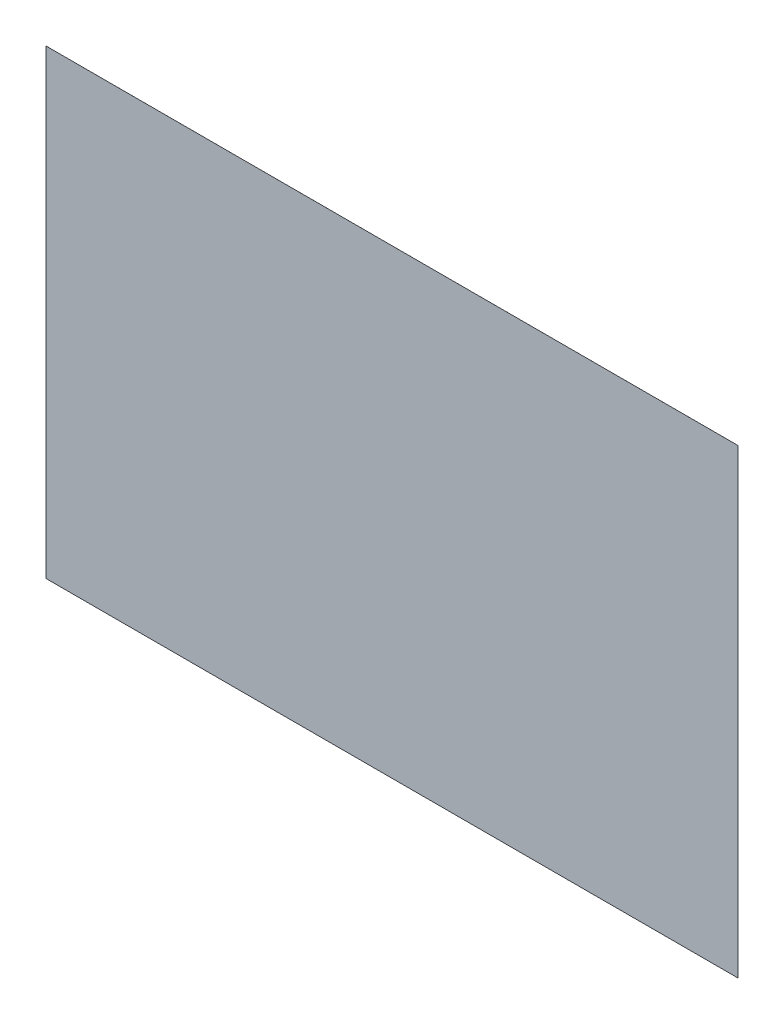
ISO-10303-21;
HEADER;
FILE_DESCRIPTION(('STEP AP214'),'2;1');
FILE_NAME('part.step','',(''),(''),'','','');
FILE_SCHEMA(('AUTOMOTIVE_DESIGN { 1 0 10303 214 1 1 1 1 }'));
ENDSEC;
DATA;
#1=APPLICATION_CONTEXT('core data for automotive mechanical design processes');
#2=APPLICATION_PROTOCOL_DEFINITION('international standard','automotive_design',2000,#1);
#3=PRODUCT_CONTEXT('',#1,'mechanical');
#4=PRODUCT('Part','Part','',(#3));
#5=PRODUCT_RELATED_PRODUCT_CATEGORY('part','',(#4));
#6=PRODUCT_DEFINITION_FORMATION('','',#4);
#7=PRODUCT_DEFINITION_CONTEXT('part definition',#1,'design');
#8=PRODUCT_DEFINITION('design','',#6,#7);
#9=PRODUCT_DEFINITION_SHAPE('','',#8);
#10=(LENGTH_UNIT() NAMED_UNIT(*) SI_UNIT(.MILLI.,.METRE.));
#11=(NAMED_UNIT(*) PLANE_ANGLE_UNIT() SI_UNIT($,.RADIAN.));
#12=(NAMED_UNIT(*) SI_UNIT($,.STERADIAN.) SOLID_ANGLE_UNIT());
#13=UNCERTAINTY_MEASURE_WITH_UNIT(LENGTH_MEASURE(1.E-05),#10,'distance_accuracy_value','');
#14=(GEOMETRIC_REPRESENTATION_CONTEXT(3) GLOBAL_UNCERTAINTY_ASSIGNED_CONTEXT((#13)) GLOBAL_UNIT_ASSIGNED_CONTEXT((#10,
#11,#12)) REPRESENTATION_CONTEXT('',''));
#15=CARTESIAN_POINT('',(0.,0.,0.));
#16=DIRECTION('',(0.,0.,1.));
#17=DIRECTION('',(1.,0.,0.));
#18=AXIS2_PLACEMENT_3D('',#15,#16,#17);
#19=CARTESIAN_POINT('',(0.,0.,-1.));
#20=DIRECTION('',(-1.,0.,0.));
#21=DIRECTION('',(0.,0.,1.));
#22=AXIS2_PLACEMENT_3D('',#19,#20,#21);
#23=PLANE('',#22);
#24=DIRECTION('',(0.,-1.,0.));
#25=VECTOR('',#24,1.);
#26=CARTESIAN_POINT('',(0.,0.,0.));
#27=LINE('',#26,#25);
#28=CARTESIAN_POINT('',(0.,40000.,0.));
#29=VERTEX_POINT('',#28);
#30=CARTESIAN_POINT('',(0.,0.,0.));
#31=VERTEX_POINT('',#30);
#32=EDGE_CURVE('E110',#29,#31,#27,.T.);
#33=ORIENTED_EDGE('',*,*,#32,.F.);
#34=DIRECTION('',(0.,0.,1.));
#35=VECTOR('',#34,1.);
#36=CARTESIAN_POINT('',(0.,40000.,-1.));
#37=LINE('',#36,#35);
#38=CARTESIAN_POINT('',(0.,40000.,-1.));
#39=VERTEX_POINT('',#38);
#40=EDGE_CURVE('E11',#39,#29,#37,.T.);
#41=ORIENTED_EDGE('',*,*,#40,.F.);
#42=DIRECTION('',(0.,-1.,0.));
#43=VECTOR('',#42,1.);
#44=CARTESIAN_POINT('',(0.,0.,-1.));
#45=LINE('',#44,#43);
#46=CARTESIAN_POINT('',(0.,0.,-1.));
#47=VERTEX_POINT('',#46);
#48=EDGE_CURVE('E101',#39,#47,#45,.T.);
#49=ORIENTED_EDGE('',*,*,#48,.T.);
#50=DIRECTION('',(0.,0.,1.));
#51=VECTOR('',#50,1.);
#52=CARTESIAN_POINT('',(0.,0.,-1.));
#53=LINE('',#52,#51);
#54=EDGE_CURVE('E46',#47,#31,#53,.T.);
#55=ORIENTED_EDGE('',*,*,#54,.T.);
#56=EDGE_LOOP('',(#33,#41,#49,#55));
#57=FACE_BOUND('',#56,.T.);
#58=ADVANCED_FACE('F43',(#57),#23,.T.);
#59=CARTESIAN_POINT('',(0.,40000.,-1.));
#60=DIRECTION('',(0.,1.,0.));
#61=DIRECTION('',(0.,0.,1.));
#62=AXIS2_PLACEMENT_3D('',#59,#60,#61);
#63=PLANE('',#62);
#64=DIRECTION('',(-1.,0.,0.));
#65=VECTOR('',#64,1.);
#66=CARTESIAN_POINT('',(0.,40000.,0.));
#67=LINE('',#66,#65);
#68=CARTESIAN_POINT('',(60000.,40000.,0.));
#69=VERTEX_POINT('',#68);
#70=EDGE_CURVE('E103',#69,#29,#67,.T.);
#71=ORIENTED_EDGE('',*,*,#70,.F.);
#72=DIRECTION('',(0.,0.,1.));
#73=VECTOR('',#72,1.);
#74=CARTESIAN_POINT('',(60000.,40000.,-1.));
#75=LINE('',#74,#73);
#76=CARTESIAN_POINT('',(60000.,40000.,-1.));
#77=VERTEX_POINT('',#76);
#78=EDGE_CURVE('E55',#77,#69,#75,.T.);
#79=ORIENTED_EDGE('',*,*,#78,.F.);
#80=DIRECTION('',(-1.,0.,0.));
#81=VECTOR('',#80,1.);
#82=CARTESIAN_POINT('',(0.,40000.,-1.));
#83=LINE('',#82,#81);
#84=EDGE_CURVE('E98',#77,#39,#83,.T.);
#85=ORIENTED_EDGE('',*,*,#84,.T.);
#86=ORIENTED_EDGE('',*,*,#40,.T.);
#87=EDGE_LOOP('',(#71,#79,#85,#86));
#88=FACE_BOUND('',#87,.T.);
#89=ADVANCED_FACE('F120',(#88),#63,.T.);
#90=CARTESIAN_POINT('',(60000.,0.,-1.));
#91=DIRECTION('',(1.,0.,0.));
#92=DIRECTION('',(0.,0.,-1.));
#93=AXIS2_PLACEMENT_3D('',#90,#91,#92);
#94=PLANE('',#93);
#95=DIRECTION('',(0.,1.,0.));
#96=VECTOR('',#95,1.);
#97=CARTESIAN_POINT('',(60000.,0.,0.));
#98=LINE('',#97,#96);
#99=CARTESIAN_POINT('',(60000.,0.,0.));
#100=VERTEX_POINT('',#99);
#101=EDGE_CURVE('E91',#100,#69,#98,.T.);
#102=ORIENTED_EDGE('',*,*,#101,.F.);
#103=DIRECTION('',(0.,0.,1.));
#104=VECTOR('',#103,1.);
#105=CARTESIAN_POINT('',(60000.,0.,-1.));
#106=LINE('',#105,#104);
#107=CARTESIAN_POINT('',(60000.,0.,-1.));
#108=VERTEX_POINT('',#107);
#109=EDGE_CURVE('E86',#108,#100,#106,.T.);
#110=ORIENTED_EDGE('',*,*,#109,.F.);
#111=DIRECTION('',(0.,1.,0.));
#112=VECTOR('',#111,1.);
#113=CARTESIAN_POINT('',(60000.,0.,-1.));
#114=LINE('',#113,#112);
#115=EDGE_CURVE('E93',#108,#77,#114,.T.);
#116=ORIENTED_EDGE('',*,*,#115,.T.);
#117=ORIENTED_EDGE('',*,*,#78,.T.);
#118=EDGE_LOOP('',(#102,#110,#116,#117));
#119=FACE_BOUND('',#118,.T.);
#120=ADVANCED_FACE('F89',(#119),#94,.T.);
#121=CARTESIAN_POINT('',(0.,0.,-1.));
#122=DIRECTION('',(0.,-1.,0.));
#123=DIRECTION('',(0.,0.,-1.));
#124=AXIS2_PLACEMENT_3D('',#121,#122,#123);
#125=PLANE('',#124);
#126=DIRECTION('',(1.,0.,0.));
#127=VECTOR('',#126,1.);
#128=CARTESIAN_POINT('',(0.,0.,0.));
#129=LINE('',#128,#127);
#130=EDGE_CURVE('E109',#31,#100,#129,.T.);
#131=ORIENTED_EDGE('',*,*,#130,.F.);
#132=ORIENTED_EDGE('',*,*,#54,.F.);
#133=DIRECTION('',(1.,0.,0.));
#134=VECTOR('',#133,1.);
#135=CARTESIAN_POINT('',(0.,0.,-1.));
#136=LINE('',#135,#134);
#137=EDGE_CURVE('E100',#47,#108,#136,.T.);
#138=ORIENTED_EDGE('',*,*,#137,.T.);
#139=ORIENTED_EDGE('',*,*,#109,.T.);
#140=EDGE_LOOP('',(#131,#132,#138,#139));
#141=FACE_BOUND('',#140,.T.);
#142=ADVANCED_FACE('F99',(#141),#125,.T.);
#143=CARTESIAN_POINT('',(0.,0.,-1.));
#144=DIRECTION('',(0.,0.,-1.));
#145=DIRECTION('',(-1.,0.,0.));
#146=AXIS2_PLACEMENT_3D('',#143,#144,#145);
#147=PLANE('',#146);
#148=ORIENTED_EDGE('',*,*,#48,.F.);
#149=ORIENTED_EDGE('',*,*,#84,.F.);
#150=ORIENTED_EDGE('',*,*,#115,.F.);
#151=ORIENTED_EDGE('',*,*,#137,.F.);
#152=EDGE_LOOP('',(#148,#149,#150,#151));
#153=FACE_BOUND('',#152,.T.);
#154=ADVANCED_FACE('F96',(#153),#147,.T.);
#155=CARTESIAN_POINT('',(0.,0.,0.));
#156=DIRECTION('',(0.,0.,-1.));
#157=DIRECTION('',(-1.,0.,0.));
#158=AXIS2_PLACEMENT_3D('',#155,#156,#157);
#159=PLANE('',#158);
#160=ORIENTED_EDGE('',*,*,#32,.T.);
#161=ORIENTED_EDGE('',*,*,#130,.T.);
#162=ORIENTED_EDGE('',*,*,#101,.T.);
#163=ORIENTED_EDGE('',*,*,#70,.T.);
#164=EDGE_LOOP('',(#160,#161,#162,#163));
#165=FACE_BOUND('',#164,.T.);
#166=ADVANCED_FACE('F116',(#165),#159,.F.);
#167=CLOSED_SHELL('',(#58,#89,#120,#142,#154,#166));
#168=MANIFOLD_SOLID_BREP('B2',#167);
#169=ADVANCED_BREP_SHAPE_REPRESENTATION('',(#18,#168),#14);
#170=SHAPE_DEFINITION_REPRESENTATION(#9,#169);
ENDSEC;
END-ISO-10303-21;
